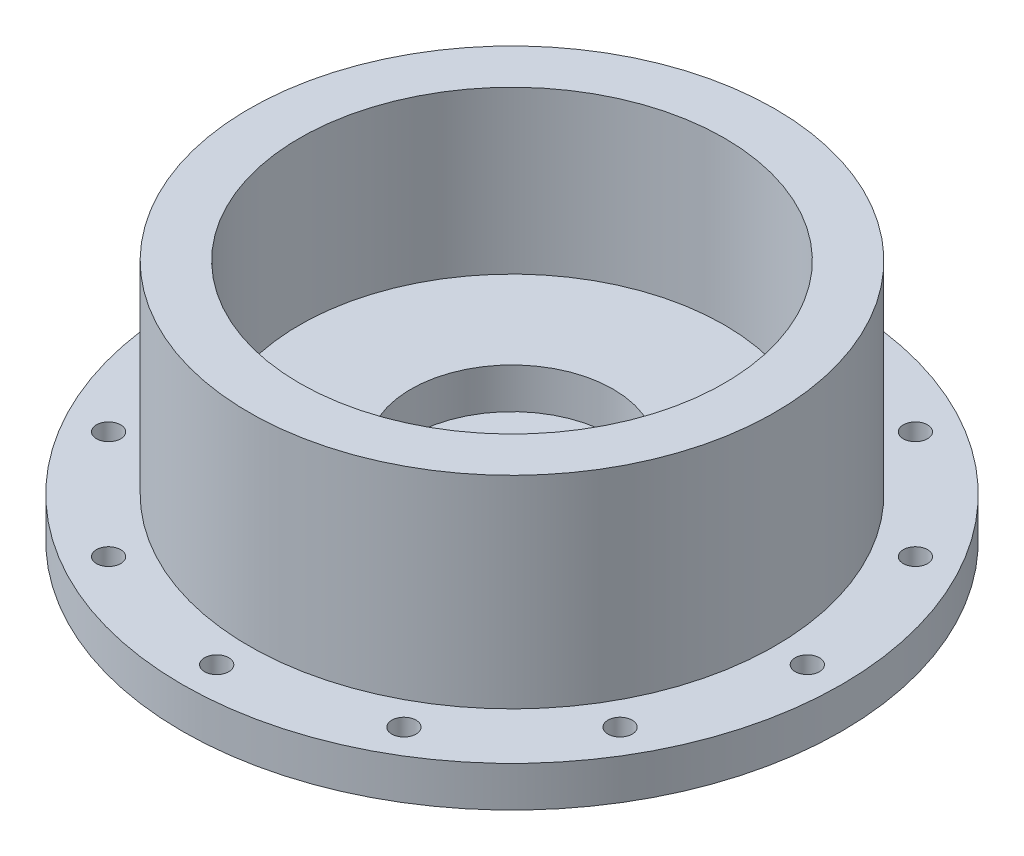
ISO-10303-21;
HEADER;
FILE_DESCRIPTION(('STEP AP214'),'2;1');
FILE_NAME('part.step','',(''),(''),'','','');
FILE_SCHEMA(('AUTOMOTIVE_DESIGN { 1 0 10303 214 1 1 1 1 }'));
ENDSEC;
DATA;
#1=APPLICATION_CONTEXT('core data for automotive mechanical design processes');
#2=APPLICATION_PROTOCOL_DEFINITION('international standard','automotive_design',2000,#1);
#3=PRODUCT_CONTEXT('',#1,'mechanical');
#4=PRODUCT('Part','Part','',(#3));
#5=PRODUCT_RELATED_PRODUCT_CATEGORY('part','',(#4));
#6=PRODUCT_DEFINITION_FORMATION('','',#4);
#7=PRODUCT_DEFINITION_CONTEXT('part definition',#1,'design');
#8=PRODUCT_DEFINITION('design','',#6,#7);
#9=PRODUCT_DEFINITION_SHAPE('','',#8);
#10=(LENGTH_UNIT() NAMED_UNIT(*) SI_UNIT(.MILLI.,.METRE.));
#11=(NAMED_UNIT(*) PLANE_ANGLE_UNIT() SI_UNIT($,.RADIAN.));
#12=(NAMED_UNIT(*) SI_UNIT($,.STERADIAN.) SOLID_ANGLE_UNIT());
#13=UNCERTAINTY_MEASURE_WITH_UNIT(LENGTH_MEASURE(1.E-05),#10,'distance_accuracy_value','');
#14=(GEOMETRIC_REPRESENTATION_CONTEXT(3) GLOBAL_UNCERTAINTY_ASSIGNED_CONTEXT((#13)) GLOBAL_UNIT_ASSIGNED_CONTEXT((#10,
#11,#12)) REPRESENTATION_CONTEXT('',''));
#15=CARTESIAN_POINT('',(0.,0.,0.));
#16=DIRECTION('',(0.,0.,1.));
#17=DIRECTION('',(1.,0.,0.));
#18=AXIS2_PLACEMENT_3D('',#15,#16,#17);
#19=CARTESIAN_POINT('',(0.,0.,0.));
#20=DIRECTION('',(0.,-1.,0.));
#21=DIRECTION('',(0.,0.,-1.));
#22=AXIS2_PLACEMENT_3D('',#19,#20,#21);
#23=CYLINDRICAL_SURFACE('',#22,65.);
#24=CARTESIAN_POINT('',(0.,40.,0.));
#25=DIRECTION('',(0.,-1.,0.));
#26=DIRECTION('',(0.,0.,-1.));
#27=AXIS2_PLACEMENT_3D('',#24,#25,#26);
#28=CIRCLE('',#27,65.);
#29=CARTESIAN_POINT('',(0.,40.,-65.));
#30=VERTEX_POINT('',#29);
#31=EDGE_CURVE('E115',#30,#30,#28,.T.);
#32=ORIENTED_EDGE('',*,*,#31,.T.);
#33=EDGE_LOOP('',(#32));
#34=FACE_BOUND('',#33,.T.);
#35=CARTESIAN_POINT('',(0.,-10.,0.));
#36=DIRECTION('',(0.,-1.,0.));
#37=DIRECTION('',(0.,0.,-1.));
#38=AXIS2_PLACEMENT_3D('',#35,#36,#37);
#39=CIRCLE('',#38,65.);
#40=CARTESIAN_POINT('',(0.,-10.,-65.));
#41=VERTEX_POINT('',#40);
#42=EDGE_CURVE('E107',#41,#41,#39,.F.);
#43=ORIENTED_EDGE('',*,*,#42,.T.);
#44=EDGE_LOOP('',(#43));
#45=FACE_BOUND('',#44,.T.);
#46=ADVANCED_FACE('F103',(#34,#45),#23,.T.);
#47=CARTESIAN_POINT('',(0.,0.,-25.));
#48=DIRECTION('',(0.,1.,0.));
#49=DIRECTION('',(0.,0.,1.));
#50=AXIS2_PLACEMENT_3D('',#47,#48,#49);
#51=PLANE('',#50);
#52=CARTESIAN_POINT('',(0.,0.,0.));
#53=DIRECTION('',(0.,-1.,0.));
#54=DIRECTION('',(0.,0.,-1.));
#55=AXIS2_PLACEMENT_3D('',#52,#53,#54);
#56=CIRCLE('',#55,25.);
#57=CARTESIAN_POINT('',(0.,0.,-25.));
#58=VERTEX_POINT('',#57);
#59=EDGE_CURVE('E11',#58,#58,#56,.T.);
#60=ORIENTED_EDGE('',*,*,#59,.T.);
#61=EDGE_LOOP('',(#60));
#62=FACE_BOUND('',#61,.T.);
#63=CARTESIAN_POINT('',(0.,0.,0.));
#64=DIRECTION('',(0.,-1.,0.));
#65=DIRECTION('',(0.,0.,-1.));
#66=AXIS2_PLACEMENT_3D('',#63,#64,#65);
#67=CIRCLE('',#66,52.5);
#68=CARTESIAN_POINT('',(0.,0.,-52.5));
#69=VERTEX_POINT('',#68);
#70=EDGE_CURVE('E123',#69,#69,#67,.T.);
#71=ORIENTED_EDGE('',*,*,#70,.F.);
#72=EDGE_LOOP('',(#71));
#73=FACE_BOUND('',#72,.T.);
#74=ADVANCED_FACE('F105',(#62,#73),#51,.T.);
#75=CARTESIAN_POINT('',(0.,0.,0.));
#76=DIRECTION('',(0.,-1.,0.));
#77=DIRECTION('',(0.,0.,-1.));
#78=AXIS2_PLACEMENT_3D('',#75,#76,#77);
#79=CYLINDRICAL_SURFACE('',#78,25.);
#80=CARTESIAN_POINT('',(0.,-10.,0.));
#81=DIRECTION('',(0.,-1.,0.));
#82=DIRECTION('',(0.,0.,-1.));
#83=AXIS2_PLACEMENT_3D('',#80,#81,#82);
#84=CIRCLE('',#83,25.);
#85=CARTESIAN_POINT('',(0.,-10.,-25.));
#86=VERTEX_POINT('',#85);
#87=EDGE_CURVE('E111',#86,#86,#84,.T.);
#88=ORIENTED_EDGE('',*,*,#87,.T.);
#89=EDGE_LOOP('',(#88));
#90=FACE_BOUND('',#89,.T.);
#91=ORIENTED_EDGE('',*,*,#59,.F.);
#92=EDGE_LOOP('',(#91));
#93=FACE_BOUND('',#92,.T.);
#94=ADVANCED_FACE('F264',(#90,#93),#79,.F.);
#95=CARTESIAN_POINT('',(0.,-10.,-25.));
#96=DIRECTION('',(0.,1.,0.));
#97=DIRECTION('',(0.,0.,1.));
#98=AXIS2_PLACEMENT_3D('',#95,#96,#97);
#99=PLANE('',#98);
#100=ORIENTED_EDGE('',*,*,#87,.F.);
#101=EDGE_LOOP('',(#100));
#102=FACE_BOUND('',#101,.T.);
#103=ADVANCED_FACE('F268',(#102),#99,.T.);
#104=CARTESIAN_POINT('',(0.,40.,-52.5));
#105=DIRECTION('',(0.,1.,0.));
#106=DIRECTION('',(0.,0.,1.));
#107=AXIS2_PLACEMENT_3D('',#104,#105,#106);
#108=PLANE('',#107);
#109=CARTESIAN_POINT('',(0.,40.,0.));
#110=DIRECTION('',(0.,-1.,0.));
#111=DIRECTION('',(0.,0.,-1.));
#112=AXIS2_PLACEMENT_3D('',#109,#110,#111);
#113=CIRCLE('',#112,52.5);
#114=CARTESIAN_POINT('',(0.,40.,-52.5));
#115=VERTEX_POINT('',#114);
#116=EDGE_CURVE('E120',#115,#115,#113,.T.);
#117=ORIENTED_EDGE('',*,*,#116,.T.);
#118=EDGE_LOOP('',(#117));
#119=FACE_BOUND('',#118,.T.);
#120=ORIENTED_EDGE('',*,*,#31,.F.);
#121=EDGE_LOOP('',(#120));
#122=FACE_BOUND('',#121,.T.);
#123=ADVANCED_FACE('F255',(#119,#122),#108,.T.);
#124=CARTESIAN_POINT('',(0.,0.,0.));
#125=DIRECTION('',(0.,-1.,0.));
#126=DIRECTION('',(0.,0.,-1.));
#127=AXIS2_PLACEMENT_3D('',#124,#125,#126);
#128=CYLINDRICAL_SURFACE('',#127,52.5);
#129=ORIENTED_EDGE('',*,*,#70,.T.);
#130=EDGE_LOOP('',(#129));
#131=FACE_BOUND('',#130,.T.);
#132=ORIENTED_EDGE('',*,*,#116,.F.);
#133=EDGE_LOOP('',(#132));
#134=FACE_BOUND('',#133,.T.);
#135=ADVANCED_FACE('F245',(#131,#134),#128,.F.);
#136=CARTESIAN_POINT('',(0.,-10.,0.));
#137=DIRECTION('',(0.,-1.,0.));
#138=DIRECTION('',(0.,0.,-1.));
#139=AXIS2_PLACEMENT_3D('',#136,#137,#138);
#140=CYLINDRICAL_SURFACE('',#139,81.5);
#141=CARTESIAN_POINT('',(0.,-10.,0.));
#142=DIRECTION('',(0.,-1.,0.));
#143=DIRECTION('',(0.,0.,-1.));
#144=AXIS2_PLACEMENT_3D('',#141,#142,#143);
#145=CIRCLE('',#144,81.5);
#146=CARTESIAN_POINT('',(0.,-10.,-81.5));
#147=VERTEX_POINT('',#146);
#148=EDGE_CURVE('E129',#147,#147,#145,.T.);
#149=ORIENTED_EDGE('',*,*,#148,.T.);
#150=EDGE_LOOP('',(#149));
#151=FACE_BOUND('',#150,.T.);
#152=CARTESIAN_POINT('',(0.,-20.,0.));
#153=DIRECTION('',(0.,-1.,0.));
#154=DIRECTION('',(0.,0.,-1.));
#155=AXIS2_PLACEMENT_3D('',#152,#153,#154);
#156=CIRCLE('',#155,81.5);
#157=CARTESIAN_POINT('',(0.,-20.,-81.5));
#158=VERTEX_POINT('',#157);
#159=EDGE_CURVE('E126',#158,#158,#156,.T.);
#160=ORIENTED_EDGE('',*,*,#159,.F.);
#161=EDGE_LOOP('',(#160));
#162=FACE_BOUND('',#161,.T.);
#163=ADVANCED_FACE('F243',(#151,#162),#140,.T.);
#164=CARTESIAN_POINT('',(0.,-10.,0.));
#165=DIRECTION('',(0.,-1.,0.));
#166=DIRECTION('',(0.,0.,-1.));
#167=AXIS2_PLACEMENT_3D('',#164,#165,#166);
#168=PLANE('',#167);
#169=ORIENTED_EDGE('',*,*,#42,.F.);
#170=EDGE_LOOP('',(#169));
#171=FACE_BOUND('',#170,.T.);
#172=CARTESIAN_POINT('',(0.,-10.,-73.));
#173=DIRECTION('',(0.,-1.,0.));
#174=DIRECTION('',(0.,0.,-1.));
#175=AXIS2_PLACEMENT_3D('',#172,#173,#174);
#176=CIRCLE('',#175,3.);
#177=CARTESIAN_POINT('',(0.,-10.,-76.));
#178=VERTEX_POINT('',#177);
#179=EDGE_CURVE('E196',#178,#178,#176,.T.);
#180=ORIENTED_EDGE('',*,*,#179,.T.);
#181=EDGE_LOOP('',(#180));
#182=FACE_BOUND('',#181,.T.);
#183=CARTESIAN_POINT('',(-36.4999999999985,-10.,-63.2198544762583));
#184=DIRECTION('',(0.,-1.,0.));
#185=DIRECTION('',(0.,0.,-1.));
#186=AXIS2_PLACEMENT_3D('',#183,#184,#185);
#187=CIRCLE('',#186,3.00000000000407);
#188=CARTESIAN_POINT('',(-36.4999999999985,-10.,-66.2198544762624));
#189=VERTEX_POINT('',#188);
#190=EDGE_CURVE('E190',#189,#189,#187,.T.);
#191=ORIENTED_EDGE('',*,*,#190,.T.);
#192=EDGE_LOOP('',(#191));
#193=FACE_BOUND('',#192,.T.);
#194=CARTESIAN_POINT('',(-63.2198544762583,-10.,-36.4999999999901));
#195=DIRECTION('',(0.,-1.,0.));
#196=DIRECTION('',(0.,0.,-1.));
#197=AXIS2_PLACEMENT_3D('',#194,#195,#196);
#198=CIRCLE('',#197,3.00000000000922);
#199=CARTESIAN_POINT('',(-63.2198544762583,-10.,-39.4999999999993));
#200=VERTEX_POINT('',#199);
#201=EDGE_CURVE('E184',#200,#200,#198,.T.);
#202=ORIENTED_EDGE('',*,*,#201,.T.);
#203=EDGE_LOOP('',(#202));
#204=FACE_BOUND('',#203,.T.);
#205=CARTESIAN_POINT('',(-72.9999999999886,-10.,1.14113163363072E-11));
#206=DIRECTION('',(0.,-1.,0.));
#207=DIRECTION('',(0.,0.,-1.));
#208=AXIS2_PLACEMENT_3D('',#205,#206,#207);
#209=CIRCLE('',#208,3.00000000001498);
#210=CARTESIAN_POINT('',(-72.9999999999886,-10.,-3.00000000000357));
#211=VERTEX_POINT('',#210);
#212=EDGE_CURVE('E178',#211,#211,#209,.T.);
#213=ORIENTED_EDGE('',*,*,#212,.T.);
#214=EDGE_LOOP('',(#213));
#215=FACE_BOUND('',#214,.T.);
#216=CARTESIAN_POINT('',(-63.2198544762469,-10.,36.5000000000099));
#217=DIRECTION('',(0.,-1.,0.));
#218=DIRECTION('',(0.,0.,-1.));
#219=AXIS2_PLACEMENT_3D('',#216,#217,#218);
#220=CIRCLE('',#219,3.00000000001994);
#221=CARTESIAN_POINT('',(-63.2198544762469,-10.,33.49999999999));
#222=VERTEX_POINT('',#221);
#223=EDGE_CURVE('E172',#222,#222,#220,.T.);
#224=ORIENTED_EDGE('',*,*,#223,.T.);
#225=EDGE_LOOP('',(#224));
#226=FACE_BOUND('',#225,.T.);
#227=CARTESIAN_POINT('',(-36.4999999999787,-10.,63.2198544762697));
#228=DIRECTION('',(0.,-1.,0.));
#229=DIRECTION('',(0.,0.,-1.));
#230=AXIS2_PLACEMENT_3D('',#227,#228,#229);
#231=CIRCLE('',#230,3.00000000002261);
#232=CARTESIAN_POINT('',(-36.4999999999787,-10.,60.2198544762471));
#233=VERTEX_POINT('',#232);
#234=EDGE_CURVE('E166',#233,#233,#231,.T.);
#235=ORIENTED_EDGE('',*,*,#234,.T.);
#236=EDGE_LOOP('',(#235));
#237=FACE_BOUND('',#236,.T.);
#238=CARTESIAN_POINT('',(2.28047528293469E-11,-10.,73.));
#239=DIRECTION('',(0.,-1.,0.));
#240=DIRECTION('',(0.,0.,-1.));
#241=AXIS2_PLACEMENT_3D('',#238,#239,#240);
#242=CIRCLE('',#241,3.0000000000223);
#243=CARTESIAN_POINT('',(2.28047528293469E-11,-10.,69.9999999999777));
#244=VERTEX_POINT('',#243);
#245=EDGE_CURVE('E160',#244,#244,#242,.T.);
#246=ORIENTED_EDGE('',*,*,#245,.T.);
#247=EDGE_LOOP('',(#246));
#248=FACE_BOUND('',#247,.T.);
#249=CARTESIAN_POINT('',(36.5000000000213,-10.,63.2198544762583));
#250=DIRECTION('',(0.,-1.,0.));
#251=DIRECTION('',(0.,0.,-1.));
#252=AXIS2_PLACEMENT_3D('',#249,#250,#251);
#253=CIRCLE('',#252,3.00000000001912);
#254=CARTESIAN_POINT('',(36.5000000000213,-10.,60.2198544762392));
#255=VERTEX_POINT('',#254);
#256=EDGE_CURVE('E154',#255,#255,#253,.T.);
#257=ORIENTED_EDGE('',*,*,#256,.T.);
#258=EDGE_LOOP('',(#257));
#259=FACE_BOUND('',#258,.T.);
#260=CARTESIAN_POINT('',(63.2198544762811,-10.,36.4999999999901));
#261=DIRECTION('',(0.,-1.,0.));
#262=DIRECTION('',(0.,0.,-1.));
#263=AXIS2_PLACEMENT_3D('',#260,#261,#262);
#264=CIRCLE('',#263,3.00000000001381);
#265=CARTESIAN_POINT('',(63.2198544762811,-10.,33.4999999999763));
#266=VERTEX_POINT('',#265);
#267=EDGE_CURVE('E148',#266,#266,#264,.T.);
#268=ORIENTED_EDGE('',*,*,#267,.T.);
#269=EDGE_LOOP('',(#268));
#270=FACE_BOUND('',#269,.T.);
#271=CARTESIAN_POINT('',(73.0000000000114,-10.,-1.14023764146734E-11));
#272=DIRECTION('',(0.,-1.,0.));
#273=DIRECTION('',(0.,0.,-1.));
#274=AXIS2_PLACEMENT_3D('',#271,#272,#273);
#275=CIRCLE('',#274,3.00000000000782);
#276=CARTESIAN_POINT('',(73.0000000000114,-10.,-3.00000000001922));
#277=VERTEX_POINT('',#276);
#278=EDGE_CURVE('E142',#277,#277,#275,.T.);
#279=ORIENTED_EDGE('',*,*,#278,.T.);
#280=EDGE_LOOP('',(#279));
#281=FACE_BOUND('',#280,.T.);
#282=CARTESIAN_POINT('',(63.2198544762697,-10.,-36.5000000000099));
#283=DIRECTION('',(0.,-1.,0.));
#284=DIRECTION('',(0.,0.,-1.));
#285=AXIS2_PLACEMENT_3D('',#282,#283,#284);
#286=CIRCLE('',#285,3.00000000000273);
#287=CARTESIAN_POINT('',(63.2198544762697,-10.,-39.5000000000126));
#288=VERTEX_POINT('',#287);
#289=EDGE_CURVE('E136',#288,#288,#286,.T.);
#290=ORIENTED_EDGE('',*,*,#289,.T.);
#291=EDGE_LOOP('',(#290));
#292=FACE_BOUND('',#291,.T.);
#293=CARTESIAN_POINT('',(36.5000000000015,-10.,-63.2198544762697));
#294=DIRECTION('',(0.,-1.,0.));
#295=DIRECTION('',(0.,0.,-1.));
#296=AXIS2_PLACEMENT_3D('',#293,#294,#295);
#297=CIRCLE('',#296,2.99999999999986);
#298=CARTESIAN_POINT('',(36.5000000000015,-10.,-66.2198544762696));
#299=VERTEX_POINT('',#298);
#300=EDGE_CURVE('E130',#299,#299,#297,.T.);
#301=ORIENTED_EDGE('',*,*,#300,.T.);
#302=EDGE_LOOP('',(#301));
#303=FACE_BOUND('',#302,.T.);
#304=ORIENTED_EDGE('',*,*,#148,.F.);
#305=EDGE_LOOP('',(#304));
#306=FACE_BOUND('',#305,.T.);
#307=ADVANCED_FACE('F205',(#171,#182,#193,#204,#215,#226,#237,#248,#259,#270,#281,#292,#303,
#306),#168,.F.);
#308=CARTESIAN_POINT('',(36.5000000000015,-10.,-63.2198544762697));
#309=DIRECTION('',(0.,-1.,0.));
#310=DIRECTION('',(0.,0.,-1.));
#311=AXIS2_PLACEMENT_3D('',#308,#309,#310);
#312=CYLINDRICAL_SURFACE('',#311,2.99999999999986);
#313=ORIENTED_EDGE('',*,*,#300,.F.);
#314=EDGE_LOOP('',(#313));
#315=FACE_BOUND('',#314,.T.);
#316=CARTESIAN_POINT('',(36.5000000000015,-20.,-63.2198544762697));
#317=DIRECTION('',(0.,-1.,0.));
#318=DIRECTION('',(0.,0.,-1.));
#319=AXIS2_PLACEMENT_3D('',#316,#317,#318);
#320=CIRCLE('',#319,2.99999999999986);
#321=CARTESIAN_POINT('',(36.5000000000015,-20.,-66.2198544762696));
#322=VERTEX_POINT('',#321);
#323=EDGE_CURVE('E133',#322,#322,#320,.T.);
#324=ORIENTED_EDGE('',*,*,#323,.T.);
#325=EDGE_LOOP('',(#324));
#326=FACE_BOUND('',#325,.T.);
#327=ADVANCED_FACE('F252',(#315,#326),#312,.F.);
#328=CARTESIAN_POINT('',(63.2198544762697,-10.,-36.5000000000099));
#329=DIRECTION('',(0.,-1.,0.));
#330=DIRECTION('',(0.,0.,-1.));
#331=AXIS2_PLACEMENT_3D('',#328,#329,#330);
#332=CYLINDRICAL_SURFACE('',#331,3.00000000000273);
#333=ORIENTED_EDGE('',*,*,#289,.F.);
#334=EDGE_LOOP('',(#333));
#335=FACE_BOUND('',#334,.T.);
#336=CARTESIAN_POINT('',(63.2198544762697,-20.,-36.5000000000099));
#337=DIRECTION('',(0.,-1.,0.));
#338=DIRECTION('',(0.,0.,-1.));
#339=AXIS2_PLACEMENT_3D('',#336,#337,#338);
#340=CIRCLE('',#339,3.00000000000273);
#341=CARTESIAN_POINT('',(63.2198544762697,-20.,-39.5000000000126));
#342=VERTEX_POINT('',#341);
#343=EDGE_CURVE('E139',#342,#342,#340,.T.);
#344=ORIENTED_EDGE('',*,*,#343,.T.);
#345=EDGE_LOOP('',(#344));
#346=FACE_BOUND('',#345,.T.);
#347=ADVANCED_FACE('F317',(#335,#346),#332,.F.);
#348=CARTESIAN_POINT('',(73.0000000000114,-10.,-1.14023764146734E-11));
#349=DIRECTION('',(0.,-1.,0.));
#350=DIRECTION('',(0.,0.,-1.));
#351=AXIS2_PLACEMENT_3D('',#348,#349,#350);
#352=CYLINDRICAL_SURFACE('',#351,3.00000000000782);
#353=ORIENTED_EDGE('',*,*,#278,.F.);
#354=EDGE_LOOP('',(#353));
#355=FACE_BOUND('',#354,.T.);
#356=CARTESIAN_POINT('',(73.0000000000114,-20.,-1.14023764146734E-11));
#357=DIRECTION('',(0.,-1.,0.));
#358=DIRECTION('',(0.,0.,-1.));
#359=AXIS2_PLACEMENT_3D('',#356,#357,#358);
#360=CIRCLE('',#359,3.00000000000782);
#361=CARTESIAN_POINT('',(73.0000000000114,-20.,-3.00000000001922));
#362=VERTEX_POINT('',#361);
#363=EDGE_CURVE('E145',#362,#362,#360,.T.);
#364=ORIENTED_EDGE('',*,*,#363,.T.);
#365=EDGE_LOOP('',(#364));
#366=FACE_BOUND('',#365,.T.);
#367=ADVANCED_FACE('F327',(#355,#366),#352,.F.);
#368=CARTESIAN_POINT('',(63.2198544762811,-10.,36.4999999999901));
#369=DIRECTION('',(0.,-1.,0.));
#370=DIRECTION('',(0.,0.,-1.));
#371=AXIS2_PLACEMENT_3D('',#368,#369,#370);
#372=CYLINDRICAL_SURFACE('',#371,3.00000000001381);
#373=ORIENTED_EDGE('',*,*,#267,.F.);
#374=EDGE_LOOP('',(#373));
#375=FACE_BOUND('',#374,.T.);
#376=CARTESIAN_POINT('',(63.2198544762811,-20.,36.4999999999901));
#377=DIRECTION('',(0.,-1.,0.));
#378=DIRECTION('',(0.,0.,-1.));
#379=AXIS2_PLACEMENT_3D('',#376,#377,#378);
#380=CIRCLE('',#379,3.00000000001381);
#381=CARTESIAN_POINT('',(63.2198544762811,-20.,33.4999999999763));
#382=VERTEX_POINT('',#381);
#383=EDGE_CURVE('E151',#382,#382,#380,.T.);
#384=ORIENTED_EDGE('',*,*,#383,.T.);
#385=EDGE_LOOP('',(#384));
#386=FACE_BOUND('',#385,.T.);
#387=ADVANCED_FACE('F337',(#375,#386),#372,.F.);
#388=CARTESIAN_POINT('',(36.5000000000213,-10.,63.2198544762583));
#389=DIRECTION('',(0.,-1.,0.));
#390=DIRECTION('',(0.,0.,-1.));
#391=AXIS2_PLACEMENT_3D('',#388,#389,#390);
#392=CYLINDRICAL_SURFACE('',#391,3.00000000001912);
#393=ORIENTED_EDGE('',*,*,#256,.F.);
#394=EDGE_LOOP('',(#393));
#395=FACE_BOUND('',#394,.T.);
#396=CARTESIAN_POINT('',(36.5000000000213,-20.,63.2198544762583));
#397=DIRECTION('',(0.,-1.,0.));
#398=DIRECTION('',(0.,0.,-1.));
#399=AXIS2_PLACEMENT_3D('',#396,#397,#398);
#400=CIRCLE('',#399,3.00000000001912);
#401=CARTESIAN_POINT('',(36.5000000000213,-20.,60.2198544762392));
#402=VERTEX_POINT('',#401);
#403=EDGE_CURVE('E157',#402,#402,#400,.T.);
#404=ORIENTED_EDGE('',*,*,#403,.T.);
#405=EDGE_LOOP('',(#404));
#406=FACE_BOUND('',#405,.T.);
#407=ADVANCED_FACE('F347',(#395,#406),#392,.F.);
#408=CARTESIAN_POINT('',(2.28047528293469E-11,-10.,73.));
#409=DIRECTION('',(0.,-1.,0.));
#410=DIRECTION('',(0.,0.,-1.));
#411=AXIS2_PLACEMENT_3D('',#408,#409,#410);
#412=CYLINDRICAL_SURFACE('',#411,3.0000000000223);
#413=ORIENTED_EDGE('',*,*,#245,.F.);
#414=EDGE_LOOP('',(#413));
#415=FACE_BOUND('',#414,.T.);
#416=CARTESIAN_POINT('',(2.28047528293469E-11,-20.,73.));
#417=DIRECTION('',(0.,-1.,0.));
#418=DIRECTION('',(0.,0.,-1.));
#419=AXIS2_PLACEMENT_3D('',#416,#417,#418);
#420=CIRCLE('',#419,3.0000000000223);
#421=CARTESIAN_POINT('',(2.28047528293469E-11,-20.,69.9999999999777));
#422=VERTEX_POINT('',#421);
#423=EDGE_CURVE('E163',#422,#422,#420,.T.);
#424=ORIENTED_EDGE('',*,*,#423,.T.);
#425=EDGE_LOOP('',(#424));
#426=FACE_BOUND('',#425,.T.);
#427=ADVANCED_FACE('F357',(#415,#426),#412,.F.);
#428=CARTESIAN_POINT('',(-36.4999999999787,-10.,63.2198544762697));
#429=DIRECTION('',(0.,-1.,0.));
#430=DIRECTION('',(0.,0.,-1.));
#431=AXIS2_PLACEMENT_3D('',#428,#429,#430);
#432=CYLINDRICAL_SURFACE('',#431,3.00000000002261);
#433=ORIENTED_EDGE('',*,*,#234,.F.);
#434=EDGE_LOOP('',(#433));
#435=FACE_BOUND('',#434,.T.);
#436=CARTESIAN_POINT('',(-36.4999999999787,-20.,63.2198544762697));
#437=DIRECTION('',(0.,-1.,0.));
#438=DIRECTION('',(0.,0.,-1.));
#439=AXIS2_PLACEMENT_3D('',#436,#437,#438);
#440=CIRCLE('',#439,3.00000000002261);
#441=CARTESIAN_POINT('',(-36.4999999999787,-20.,60.2198544762471));
#442=VERTEX_POINT('',#441);
#443=EDGE_CURVE('E169',#442,#442,#440,.T.);
#444=ORIENTED_EDGE('',*,*,#443,.T.);
#445=EDGE_LOOP('',(#444));
#446=FACE_BOUND('',#445,.T.);
#447=ADVANCED_FACE('F367',(#435,#446),#432,.F.);
#448=CARTESIAN_POINT('',(-63.2198544762469,-10.,36.5000000000099));
#449=DIRECTION('',(0.,-1.,0.));
#450=DIRECTION('',(0.,0.,-1.));
#451=AXIS2_PLACEMENT_3D('',#448,#449,#450);
#452=CYLINDRICAL_SURFACE('',#451,3.00000000001994);
#453=ORIENTED_EDGE('',*,*,#223,.F.);
#454=EDGE_LOOP('',(#453));
#455=FACE_BOUND('',#454,.T.);
#456=CARTESIAN_POINT('',(-63.2198544762469,-20.,36.5000000000099));
#457=DIRECTION('',(0.,-1.,0.));
#458=DIRECTION('',(0.,0.,-1.));
#459=AXIS2_PLACEMENT_3D('',#456,#457,#458);
#460=CIRCLE('',#459,3.00000000001994);
#461=CARTESIAN_POINT('',(-63.2198544762469,-20.,33.49999999999));
#462=VERTEX_POINT('',#461);
#463=EDGE_CURVE('E175',#462,#462,#460,.T.);
#464=ORIENTED_EDGE('',*,*,#463,.T.);
#465=EDGE_LOOP('',(#464));
#466=FACE_BOUND('',#465,.T.);
#467=ADVANCED_FACE('F377',(#455,#466),#452,.F.);
#468=CARTESIAN_POINT('',(-72.9999999999886,-10.,1.14113163363072E-11));
#469=DIRECTION('',(0.,-1.,0.));
#470=DIRECTION('',(0.,0.,-1.));
#471=AXIS2_PLACEMENT_3D('',#468,#469,#470);
#472=CYLINDRICAL_SURFACE('',#471,3.00000000001498);
#473=ORIENTED_EDGE('',*,*,#212,.F.);
#474=EDGE_LOOP('',(#473));
#475=FACE_BOUND('',#474,.T.);
#476=CARTESIAN_POINT('',(-72.9999999999886,-20.,1.14113163363072E-11));
#477=DIRECTION('',(0.,-1.,0.));
#478=DIRECTION('',(0.,0.,-1.));
#479=AXIS2_PLACEMENT_3D('',#476,#477,#478);
#480=CIRCLE('',#479,3.00000000001498);
#481=CARTESIAN_POINT('',(-72.9999999999886,-20.,-3.00000000000357));
#482=VERTEX_POINT('',#481);
#483=EDGE_CURVE('E181',#482,#482,#480,.T.);
#484=ORIENTED_EDGE('',*,*,#483,.T.);
#485=EDGE_LOOP('',(#484));
#486=FACE_BOUND('',#485,.T.);
#487=ADVANCED_FACE('F387',(#475,#486),#472,.F.);
#488=CARTESIAN_POINT('',(-63.2198544762583,-10.,-36.4999999999901));
#489=DIRECTION('',(0.,-1.,0.));
#490=DIRECTION('',(0.,0.,-1.));
#491=AXIS2_PLACEMENT_3D('',#488,#489,#490);
#492=CYLINDRICAL_SURFACE('',#491,3.00000000000922);
#493=ORIENTED_EDGE('',*,*,#201,.F.);
#494=EDGE_LOOP('',(#493));
#495=FACE_BOUND('',#494,.T.);
#496=CARTESIAN_POINT('',(-63.2198544762583,-20.,-36.4999999999901));
#497=DIRECTION('',(0.,-1.,0.));
#498=DIRECTION('',(0.,0.,-1.));
#499=AXIS2_PLACEMENT_3D('',#496,#497,#498);
#500=CIRCLE('',#499,3.00000000000922);
#501=CARTESIAN_POINT('',(-63.2198544762583,-20.,-39.4999999999993));
#502=VERTEX_POINT('',#501);
#503=EDGE_CURVE('E187',#502,#502,#500,.T.);
#504=ORIENTED_EDGE('',*,*,#503,.T.);
#505=EDGE_LOOP('',(#504));
#506=FACE_BOUND('',#505,.T.);
#507=ADVANCED_FACE('F397',(#495,#506),#492,.F.);
#508=CARTESIAN_POINT('',(-36.4999999999985,-10.,-63.2198544762583));
#509=DIRECTION('',(0.,-1.,0.));
#510=DIRECTION('',(0.,0.,-1.));
#511=AXIS2_PLACEMENT_3D('',#508,#509,#510);
#512=CYLINDRICAL_SURFACE('',#511,3.00000000000407);
#513=ORIENTED_EDGE('',*,*,#190,.F.);
#514=EDGE_LOOP('',(#513));
#515=FACE_BOUND('',#514,.T.);
#516=CARTESIAN_POINT('',(-36.4999999999985,-20.,-63.2198544762583));
#517=DIRECTION('',(0.,-1.,0.));
#518=DIRECTION('',(0.,0.,-1.));
#519=AXIS2_PLACEMENT_3D('',#516,#517,#518);
#520=CIRCLE('',#519,3.00000000000407);
#521=CARTESIAN_POINT('',(-36.4999999999985,-20.,-66.2198544762624));
#522=VERTEX_POINT('',#521);
#523=EDGE_CURVE('E193',#522,#522,#520,.T.);
#524=ORIENTED_EDGE('',*,*,#523,.T.);
#525=EDGE_LOOP('',(#524));
#526=FACE_BOUND('',#525,.T.);
#527=ADVANCED_FACE('F212',(#515,#526),#512,.F.);
#528=CARTESIAN_POINT('',(0.,-10.,-73.));
#529=DIRECTION('',(0.,-1.,0.));
#530=DIRECTION('',(0.,0.,-1.));
#531=AXIS2_PLACEMENT_3D('',#528,#529,#530);
#532=CYLINDRICAL_SURFACE('',#531,3.);
#533=ORIENTED_EDGE('',*,*,#179,.F.);
#534=EDGE_LOOP('',(#533));
#535=FACE_BOUND('',#534,.T.);
#536=CARTESIAN_POINT('',(0.,-20.,-73.));
#537=DIRECTION('',(0.,-1.,0.));
#538=DIRECTION('',(0.,0.,-1.));
#539=AXIS2_PLACEMENT_3D('',#536,#537,#538);
#540=CIRCLE('',#539,3.);
#541=CARTESIAN_POINT('',(0.,-20.,-76.));
#542=VERTEX_POINT('',#541);
#543=EDGE_CURVE('E199',#542,#542,#540,.T.);
#544=ORIENTED_EDGE('',*,*,#543,.T.);
#545=EDGE_LOOP('',(#544));
#546=FACE_BOUND('',#545,.T.);
#547=ADVANCED_FACE('F208',(#535,#546),#532,.F.);
#548=CARTESIAN_POINT('',(0.,-20.,0.));
#549=DIRECTION('',(0.,-1.,0.));
#550=DIRECTION('',(0.,0.,-1.));
#551=AXIS2_PLACEMENT_3D('',#548,#549,#550);
#552=PLANE('',#551);
#553=ORIENTED_EDGE('',*,*,#543,.F.);
#554=EDGE_LOOP('',(#553));
#555=FACE_BOUND('',#554,.T.);
#556=ORIENTED_EDGE('',*,*,#523,.F.);
#557=EDGE_LOOP('',(#556));
#558=FACE_BOUND('',#557,.T.);
#559=ORIENTED_EDGE('',*,*,#503,.F.);
#560=EDGE_LOOP('',(#559));
#561=FACE_BOUND('',#560,.T.);
#562=ORIENTED_EDGE('',*,*,#483,.F.);
#563=EDGE_LOOP('',(#562));
#564=FACE_BOUND('',#563,.T.);
#565=ORIENTED_EDGE('',*,*,#463,.F.);
#566=EDGE_LOOP('',(#565));
#567=FACE_BOUND('',#566,.T.);
#568=ORIENTED_EDGE('',*,*,#443,.F.);
#569=EDGE_LOOP('',(#568));
#570=FACE_BOUND('',#569,.T.);
#571=ORIENTED_EDGE('',*,*,#423,.F.);
#572=EDGE_LOOP('',(#571));
#573=FACE_BOUND('',#572,.T.);
#574=ORIENTED_EDGE('',*,*,#403,.F.);
#575=EDGE_LOOP('',(#574));
#576=FACE_BOUND('',#575,.T.);
#577=ORIENTED_EDGE('',*,*,#383,.F.);
#578=EDGE_LOOP('',(#577));
#579=FACE_BOUND('',#578,.T.);
#580=ORIENTED_EDGE('',*,*,#363,.F.);
#581=EDGE_LOOP('',(#580));
#582=FACE_BOUND('',#581,.T.);
#583=ORIENTED_EDGE('',*,*,#343,.F.);
#584=EDGE_LOOP('',(#583));
#585=FACE_BOUND('',#584,.T.);
#586=ORIENTED_EDGE('',*,*,#323,.F.);
#587=EDGE_LOOP('',(#586));
#588=FACE_BOUND('',#587,.T.);
#589=ORIENTED_EDGE('',*,*,#159,.T.);
#590=EDGE_LOOP('',(#589));
#591=FACE_BOUND('',#590,.T.);
#592=ADVANCED_FACE('F211',(#555,#558,#561,#564,#567,#570,#573,#576,#579,#582,#585,#588,#591),
#552,.T.);
#593=CLOSED_SHELL('',(#46,#74,#94,#103,#123,#135,#163,#307,#327,#347,#367,#387,#407,#427,#447,
#467,#487,#507,#527,#547,#592));
#594=MANIFOLD_SOLID_BREP('B2',#593);
#595=ADVANCED_BREP_SHAPE_REPRESENTATION('',(#18,#594),#14);
#596=SHAPE_DEFINITION_REPRESENTATION(#9,#595);
ENDSEC;
END-ISO-10303-21;
